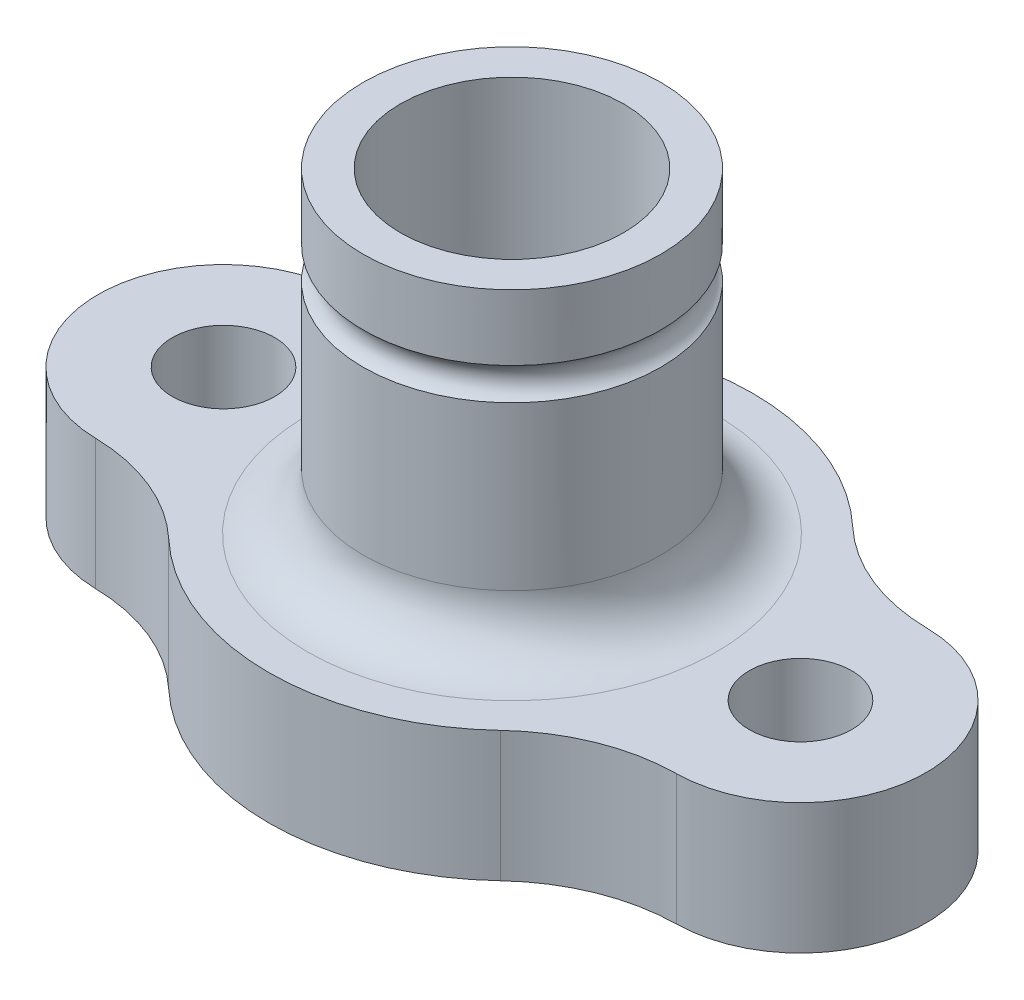
ISO-10303-21;
HEADER;
FILE_DESCRIPTION(('STEP AP214'),'2;1');
FILE_NAME('part.step','',(''),(''),'','','');
FILE_SCHEMA(('AUTOMOTIVE_DESIGN { 1 0 10303 214 1 1 1 1 }'));
ENDSEC;
DATA;
#1=APPLICATION_CONTEXT('core data for automotive mechanical design processes');
#2=APPLICATION_PROTOCOL_DEFINITION('international standard','automotive_design',2000,#1);
#3=PRODUCT_CONTEXT('',#1,'mechanical');
#4=PRODUCT('Part','Part','',(#3));
#5=PRODUCT_RELATED_PRODUCT_CATEGORY('part','',(#4));
#6=PRODUCT_DEFINITION_FORMATION('','',#4);
#7=PRODUCT_DEFINITION_CONTEXT('part definition',#1,'design');
#8=PRODUCT_DEFINITION('design','',#6,#7);
#9=PRODUCT_DEFINITION_SHAPE('','',#8);
#10=(LENGTH_UNIT() NAMED_UNIT(*) SI_UNIT(.MILLI.,.METRE.));
#11=(NAMED_UNIT(*) PLANE_ANGLE_UNIT() SI_UNIT($,.RADIAN.));
#12=(NAMED_UNIT(*) SI_UNIT($,.STERADIAN.) SOLID_ANGLE_UNIT());
#13=UNCERTAINTY_MEASURE_WITH_UNIT(LENGTH_MEASURE(1.E-05),#10,'distance_accuracy_value','');
#14=(GEOMETRIC_REPRESENTATION_CONTEXT(3) GLOBAL_UNCERTAINTY_ASSIGNED_CONTEXT((#13)) GLOBAL_UNIT_ASSIGNED_CONTEXT((#10,
#11,#12)) REPRESENTATION_CONTEXT('',''));
#15=CARTESIAN_POINT('',(0.,0.,0.));
#16=DIRECTION('',(0.,0.,1.));
#17=DIRECTION('',(1.,0.,0.));
#18=AXIS2_PLACEMENT_3D('',#15,#16,#17);
#19=CARTESIAN_POINT('',(0.,19.6088446071888,0.));
#20=DIRECTION('',(0.,-1.,0.));
#21=DIRECTION('',(0.,0.,-1.));
#22=AXIS2_PLACEMENT_3D('',#19,#20,#21);
#23=TOROIDAL_SURFACE('',#22,8.5,1.);
#24=CARTESIAN_POINT('',(0.,18.7428192034043,0.));
#25=DIRECTION('',(0.,1.,0.));
#26=DIRECTION('',(0.,0.,1.));
#27=AXIS2_PLACEMENT_3D('',#24,#25,#26);
#28=CIRCLE('',#27,8.);
#29=CARTESIAN_POINT('',(0.,18.7428192034043,8.));
#30=VERTEX_POINT('',#29);
#31=EDGE_CURVE('E11',#30,#30,#28,.F.);
#32=ORIENTED_EDGE('',*,*,#31,.F.);
#33=EDGE_LOOP('',(#32));
#34=FACE_BOUND('',#33,.T.);
#35=CARTESIAN_POINT('',(0.,20.4748700109732,0.));
#36=DIRECTION('',(0.,-1.,0.));
#37=DIRECTION('',(0.,0.,-1.));
#38=AXIS2_PLACEMENT_3D('',#35,#36,#37);
#39=CIRCLE('',#38,8.);
#40=CARTESIAN_POINT('',(0.,20.4748700109732,-8.));
#41=VERTEX_POINT('',#40);
#42=EDGE_CURVE('E48',#41,#41,#39,.F.);
#43=ORIENTED_EDGE('',*,*,#42,.F.);
#44=EDGE_LOOP('',(#43));
#45=FACE_BOUND('',#44,.T.);
#46=ADVANCED_FACE('F39',(#34,#45),#23,.F.);
#47=CARTESIAN_POINT('',(0.,7.,0.));
#48=DIRECTION('',(0.,-1.,0.));
#49=DIRECTION('',(0.,0.,-1.));
#50=AXIS2_PLACEMENT_3D('',#47,#48,#49);
#51=CYLINDRICAL_SURFACE('',#50,7.);
#52=CARTESIAN_POINT('',(0.,4.76393202250021,0.));
#53=DIRECTION('',(0.,1.,0.));
#54=DIRECTION('',(0.,0.,1.));
#55=AXIS2_PLACEMENT_3D('',#52,#53,#54);
#56=CIRCLE('',#55,7.);
#57=CARTESIAN_POINT('',(0.,4.76393202250021,7.));
#58=VERTEX_POINT('',#57);
#59=EDGE_CURVE('E187',#58,#58,#56,.T.);
#60=ORIENTED_EDGE('',*,*,#59,.T.);
#61=EDGE_LOOP('',(#60));
#62=FACE_BOUND('',#61,.T.);
#63=CARTESIAN_POINT('',(0.,0.,0.));
#64=DIRECTION('',(0.,1.,0.));
#65=DIRECTION('',(0.,0.,1.));
#66=AXIS2_PLACEMENT_3D('',#63,#64,#65);
#67=CIRCLE('',#66,7.);
#68=CARTESIAN_POINT('',(0.,0.,7.));
#69=VERTEX_POINT('',#68);
#70=EDGE_CURVE('E147',#69,#69,#67,.T.);
#71=ORIENTED_EDGE('',*,*,#70,.F.);
#72=EDGE_LOOP('',(#71));
#73=FACE_BOUND('',#72,.T.);
#74=ADVANCED_FACE('F214',(#62,#73),#51,.F.);
#75=CARTESIAN_POINT('',(0.,4.76393202250021,0.));
#76=DIRECTION('',(0.,1.,0.));
#77=DIRECTION('',(0.,0.,1.));
#78=AXIS2_PLACEMENT_3D('',#75,#76,#77);
#79=TOROIDAL_SURFACE('',#78,4.,3.);
#80=CARTESIAN_POINT('',(0.,6.42224441767791,0.));
#81=DIRECTION('',(0.,-1.,0.));
#82=DIRECTION('',(0.,0.,-1.));
#83=AXIS2_PLACEMENT_3D('',#80,#81,#82);
#84=CIRCLE('',#83,6.5);
#85=CARTESIAN_POINT('',(0.,6.42224441767791,-6.5));
#86=VERTEX_POINT('',#85);
#87=EDGE_CURVE('E199',#86,#86,#84,.F.);
#88=ORIENTED_EDGE('',*,*,#87,.T.);
#89=EDGE_LOOP('',(#88));
#90=FACE_BOUND('',#89,.T.);
#91=ORIENTED_EDGE('',*,*,#59,.F.);
#92=EDGE_LOOP('',(#91));
#93=FACE_BOUND('',#92,.T.);
#94=ADVANCED_FACE('F220',(#90,#93),#79,.F.);
#95=CARTESIAN_POINT('',(0.,8.08055681285561,0.));
#96=DIRECTION('',(0.,-1.,0.));
#97=DIRECTION('',(0.,0.,-1.));
#98=AXIS2_PLACEMENT_3D('',#95,#96,#97);
#99=TOROIDAL_SURFACE('',#98,9.,3.);
#100=CARTESIAN_POINT('',(0.,8.08055681285561,0.));
#101=DIRECTION('',(0.,-1.,0.));
#102=DIRECTION('',(0.,0.,-1.));
#103=AXIS2_PLACEMENT_3D('',#100,#101,#102);
#104=CIRCLE('',#103,6.);
#105=CARTESIAN_POINT('',(0.,8.08055681285561,-6.));
#106=VERTEX_POINT('',#105);
#107=EDGE_CURVE('E203',#106,#106,#104,.T.);
#108=ORIENTED_EDGE('',*,*,#107,.F.);
#109=EDGE_LOOP('',(#108));
#110=FACE_BOUND('',#109,.T.);
#111=ORIENTED_EDGE('',*,*,#87,.F.);
#112=EDGE_LOOP('',(#111));
#113=FACE_BOUND('',#112,.T.);
#114=ADVANCED_FACE('F251',(#110,#113),#99,.T.);
#115=CARTESIAN_POINT('',(0.,24.,0.));
#116=DIRECTION('',(0.,-1.,0.));
#117=DIRECTION('',(0.,0.,-1.));
#118=AXIS2_PLACEMENT_3D('',#115,#116,#117);
#119=CYLINDRICAL_SURFACE('',#118,6.);
#120=ORIENTED_EDGE('',*,*,#107,.T.);
#121=EDGE_LOOP('',(#120));
#122=FACE_BOUND('',#121,.T.);
#123=CARTESIAN_POINT('',(0.,24.,0.));
#124=DIRECTION('',(0.,1.,0.));
#125=DIRECTION('',(0.,0.,1.));
#126=AXIS2_PLACEMENT_3D('',#123,#124,#125);
#127=CIRCLE('',#126,6.);
#128=CARTESIAN_POINT('',(0.,24.,6.));
#129=VERTEX_POINT('',#128);
#130=EDGE_CURVE('E260',#129,#129,#127,.T.);
#131=ORIENTED_EDGE('',*,*,#130,.T.);
#132=EDGE_LOOP('',(#131));
#133=FACE_BOUND('',#132,.T.);
#134=ADVANCED_FACE('F246',(#122,#133),#119,.F.);
#135=CARTESIAN_POINT('',(0.,24.,0.));
#136=DIRECTION('',(0.,1.,0.));
#137=DIRECTION('',(0.,0.,1.));
#138=AXIS2_PLACEMENT_3D('',#135,#136,#137);
#139=PLANE('',#138);
#140=CARTESIAN_POINT('',(0.,24.,0.));
#141=DIRECTION('',(0.,1.,0.));
#142=DIRECTION('',(0.,0.,1.));
#143=AXIS2_PLACEMENT_3D('',#140,#141,#142);
#144=CIRCLE('',#143,8.);
#145=CARTESIAN_POINT('',(0.,24.,8.));
#146=VERTEX_POINT('',#145);
#147=EDGE_CURVE('E257',#146,#146,#144,.T.);
#148=ORIENTED_EDGE('',*,*,#147,.T.);
#149=EDGE_LOOP('',(#148));
#150=FACE_BOUND('',#149,.T.);
#151=ORIENTED_EDGE('',*,*,#130,.F.);
#152=EDGE_LOOP('',(#151));
#153=FACE_BOUND('',#152,.T.);
#154=ADVANCED_FACE('F238',(#150,#153),#139,.T.);
#155=CARTESIAN_POINT('',(0.,24.,0.));
#156=DIRECTION('',(0.,-1.,0.));
#157=DIRECTION('',(0.,0.,-1.));
#158=AXIS2_PLACEMENT_3D('',#155,#156,#157);
#159=CYLINDRICAL_SURFACE('',#158,8.);
#160=ORIENTED_EDGE('',*,*,#42,.T.);
#161=EDGE_LOOP('',(#160));
#162=FACE_BOUND('',#161,.T.);
#163=ORIENTED_EDGE('',*,*,#147,.F.);
#164=EDGE_LOOP('',(#163));
#165=FACE_BOUND('',#164,.T.);
#166=ADVANCED_FACE('F210',(#162,#165),#159,.T.);
#167=CARTESIAN_POINT('',(-15.6666732992892,0.,8.37334132896206));
#168=DIRECTION('',(0.,1.,0.));
#169=DIRECTION('',(0.,0.,1.));
#170=AXIS2_PLACEMENT_3D('',#167,#168,#169);
#171=PLANE('',#170);
#172=CARTESIAN_POINT('',(-15.8333465985785,0.,16.7466826579241));
#173=DIRECTION('',(0.,-1.,0.));
#174=DIRECTION('',(0.,0.,1.));
#175=AXIS2_PLACEMENT_3D('',#172,#173,#174);
#176=CIRCLE('',#175,10.);
#177=CARTESIAN_POINT('',(-15.6343337039048,0.,6.74866316065599));
#178=VERTEX_POINT('',#177);
#179=CARTESIAN_POINT('',(-8.97881406538982,0.,9.46551628491364));
#180=VERTEX_POINT('',#179);
#181=EDGE_CURVE('E142',#178,#180,#176,.T.);
#182=ORIENTED_EDGE('',*,*,#181,.F.);
#183=CARTESIAN_POINT('',(-15.5,0.,0.));
#184=DIRECTION('',(0.,1.,0.));
#185=DIRECTION('',(0.,0.,1.));
#186=AXIS2_PLACEMENT_3D('',#183,#184,#185);
#187=CIRCLE('',#186,6.75);
#188=CARTESIAN_POINT('',(-15.6343337039047,0.,-6.74866316065598));
#189=VERTEX_POINT('',#188);
#190=EDGE_CURVE('E91',#189,#178,#187,.T.);
#191=ORIENTED_EDGE('',*,*,#190,.F.);
#192=CARTESIAN_POINT('',(-15.8333465985785,0.,-16.7466826579241));
#193=DIRECTION('',(0.,-1.,0.));
#194=DIRECTION('',(0.,0.,-1.));
#195=AXIS2_PLACEMENT_3D('',#192,#193,#194);
#196=CIRCLE('',#195,10.);
#197=CARTESIAN_POINT('',(-8.97881406538982,0.,-9.46551628491363));
#198=VERTEX_POINT('',#197);
#199=EDGE_CURVE('E85',#198,#189,#196,.T.);
#200=ORIENTED_EDGE('',*,*,#199,.F.);
#201=CARTESIAN_POINT('',(-0.0679217722446071,0.,0.));
#202=DIRECTION('',(0.,1.,0.));
#203=DIRECTION('',(0.,0.,1.));
#204=AXIS2_PLACEMENT_3D('',#201,#202,#203);
#205=CIRCLE('',#204,13.);
#206=CARTESIAN_POINT('',(8.84166144320779,0.,-9.46674848757106));
#207=VERTEX_POINT('',#206);
#208=EDGE_CURVE('E129',#207,#198,#205,.T.);
#209=ORIENTED_EDGE('',*,*,#208,.F.);
#210=CARTESIAN_POINT('',(15.6951869935558,0.,-16.7488627087796));
#211=DIRECTION('',(0.,-1.,0.));
#212=DIRECTION('',(0.,0.,-1.));
#213=AXIS2_PLACEMENT_3D('',#210,#211,#212);
#214=CIRCLE('',#213,10.);
#215=CARTESIAN_POINT('',(15.5786574451643,0.,-6.74954168861266));
#216=VERTEX_POINT('',#215);
#217=EDGE_CURVE('E156',#216,#207,#214,.T.);
#218=ORIENTED_EDGE('',*,*,#217,.F.);
#219=CARTESIAN_POINT('',(15.5,0.,0.));
#220=DIRECTION('',(0.,1.,0.));
#221=DIRECTION('',(0.,0.,1.));
#222=AXIS2_PLACEMENT_3D('',#219,#220,#221);
#223=CIRCLE('',#222,6.75);
#224=CARTESIAN_POINT('',(15.5786574451643,0.,6.74954168861266));
#225=VERTEX_POINT('',#224);
#226=EDGE_CURVE('E153',#225,#216,#223,.T.);
#227=ORIENTED_EDGE('',*,*,#226,.F.);
#228=CARTESIAN_POINT('',(15.6951869935558,0.,16.7488627087796));
#229=DIRECTION('',(0.,-1.,0.));
#230=DIRECTION('',(0.,0.,-1.));
#231=AXIS2_PLACEMENT_3D('',#228,#229,#230);
#232=CIRCLE('',#231,10.);
#233=CARTESIAN_POINT('',(8.8416614432078,0.,9.46674848757105));
#234=VERTEX_POINT('',#233);
#235=EDGE_CURVE('E150',#234,#225,#232,.T.);
#236=ORIENTED_EDGE('',*,*,#235,.F.);
#237=CARTESIAN_POINT('',(-0.0679217722446071,0.,0.));
#238=DIRECTION('',(0.,1.,0.));
#239=DIRECTION('',(0.,0.,1.));
#240=AXIS2_PLACEMENT_3D('',#237,#238,#239);
#241=CIRCLE('',#240,13.);
#242=EDGE_CURVE('E146',#180,#234,#241,.T.);
#243=ORIENTED_EDGE('',*,*,#242,.F.);
#244=EDGE_LOOP('',(#182,#191,#200,#209,#218,#227,#236,#243));
#245=FACE_BOUND('',#244,.T.);
#246=ORIENTED_EDGE('',*,*,#70,.T.);
#247=EDGE_LOOP('',(#246));
#248=FACE_BOUND('',#247,.T.);
#249=CARTESIAN_POINT('',(-15.5,0.,0.));
#250=DIRECTION('',(0.,1.,0.));
#251=DIRECTION('',(0.,0.,1.));
#252=AXIS2_PLACEMENT_3D('',#249,#250,#251);
#253=CIRCLE('',#252,2.75);
#254=CARTESIAN_POINT('',(-15.5,0.,2.75));
#255=VERTEX_POINT('',#254);
#256=EDGE_CURVE('E272',#255,#255,#253,.T.);
#257=ORIENTED_EDGE('',*,*,#256,.T.);
#258=EDGE_LOOP('',(#257));
#259=FACE_BOUND('',#258,.T.);
#260=CARTESIAN_POINT('',(15.5,0.,0.));
#261=DIRECTION('',(0.,1.,0.));
#262=DIRECTION('',(0.,0.,1.));
#263=AXIS2_PLACEMENT_3D('',#260,#261,#262);
#264=CIRCLE('',#263,2.75);
#265=CARTESIAN_POINT('',(15.5,0.,2.75));
#266=VERTEX_POINT('',#265);
#267=EDGE_CURVE('E265',#266,#266,#264,.T.);
#268=ORIENTED_EDGE('',*,*,#267,.T.);
#269=EDGE_LOOP('',(#268));
#270=FACE_BOUND('',#269,.T.);
#271=ADVANCED_FACE('F237',(#245,#248,#259,#270),#171,.F.);
#272=CARTESIAN_POINT('',(15.5,7.,0.));
#273=DIRECTION('',(0.,-1.,0.));
#274=DIRECTION('',(0.,0.,-1.));
#275=AXIS2_PLACEMENT_3D('',#272,#273,#274);
#276=CYLINDRICAL_SURFACE('',#275,2.75);
#277=CARTESIAN_POINT('',(15.5,7.,0.));
#278=DIRECTION('',(0.,1.,0.));
#279=DIRECTION('',(0.,0.,1.));
#280=AXIS2_PLACEMENT_3D('',#277,#278,#279);
#281=CIRCLE('',#280,2.75);
#282=CARTESIAN_POINT('',(15.5,7.,2.75));
#283=VERTEX_POINT('',#282);
#284=EDGE_CURVE('E268',#283,#283,#281,.T.);
#285=ORIENTED_EDGE('',*,*,#284,.T.);
#286=EDGE_LOOP('',(#285));
#287=FACE_BOUND('',#286,.T.);
#288=ORIENTED_EDGE('',*,*,#267,.F.);
#289=EDGE_LOOP('',(#288));
#290=FACE_BOUND('',#289,.T.);
#291=ADVANCED_FACE('F243',(#287,#290),#276,.F.);
#292=CARTESIAN_POINT('',(-15.5,7.,0.));
#293=DIRECTION('',(0.,-1.,0.));
#294=DIRECTION('',(0.,0.,-1.));
#295=AXIS2_PLACEMENT_3D('',#292,#293,#294);
#296=CYLINDRICAL_SURFACE('',#295,6.75);
#297=ORIENTED_EDGE('',*,*,#190,.T.);
#298=DIRECTION('',(0.,-1.,0.));
#299=VECTOR('',#298,1.);
#300=CARTESIAN_POINT('',(-15.6343337039048,7.,6.74866316065599));
#301=LINE('',#300,#299);
#302=CARTESIAN_POINT('',(-15.6343337039048,7.,6.74866316065599));
#303=VERTEX_POINT('',#302);
#304=EDGE_CURVE('E138',#303,#178,#301,.T.);
#305=ORIENTED_EDGE('',*,*,#304,.F.);
#306=CARTESIAN_POINT('',(-15.5,7.,0.));
#307=DIRECTION('',(0.,1.,0.));
#308=DIRECTION('',(0.,0.,1.));
#309=AXIS2_PLACEMENT_3D('',#306,#307,#308);
#310=CIRCLE('',#309,6.75);
#311=CARTESIAN_POINT('',(-15.6343337039047,7.,-6.74866316065598));
#312=VERTEX_POINT('',#311);
#313=EDGE_CURVE('E56',#312,#303,#310,.T.);
#314=ORIENTED_EDGE('',*,*,#313,.F.);
#315=DIRECTION('',(0.,-1.,0.));
#316=VECTOR('',#315,1.);
#317=CARTESIAN_POINT('',(-15.6343337039047,7.,-6.74866316065598));
#318=LINE('',#317,#316);
#319=EDGE_CURVE('E132',#312,#189,#318,.T.);
#320=ORIENTED_EDGE('',*,*,#319,.T.);
#321=EDGE_LOOP('',(#297,#305,#314,#320));
#322=FACE_BOUND('',#321,.T.);
#323=ADVANCED_FACE('F313',(#322),#296,.T.);
#324=CARTESIAN_POINT('',(-15.8333465985785,7.,-16.7466826579241));
#325=DIRECTION('',(0.,-1.,0.));
#326=DIRECTION('',(0.,0.,-1.));
#327=AXIS2_PLACEMENT_3D('',#324,#325,#326);
#328=CYLINDRICAL_SURFACE('',#327,10.);
#329=ORIENTED_EDGE('',*,*,#199,.T.);
#330=ORIENTED_EDGE('',*,*,#319,.F.);
#331=CARTESIAN_POINT('',(-15.8333465985785,7.,-16.7466826579241));
#332=DIRECTION('',(0.,-1.,0.));
#333=DIRECTION('',(0.,0.,-1.));
#334=AXIS2_PLACEMENT_3D('',#331,#332,#333);
#335=CIRCLE('',#334,10.);
#336=CARTESIAN_POINT('',(-8.97881406538982,7.,-9.46551628491363));
#337=VERTEX_POINT('',#336);
#338=EDGE_CURVE('E118',#337,#312,#335,.T.);
#339=ORIENTED_EDGE('',*,*,#338,.F.);
#340=DIRECTION('',(0.,-1.,0.));
#341=VECTOR('',#340,1.);
#342=CARTESIAN_POINT('',(-8.97881406538982,7.,-9.46551628491363));
#343=LINE('',#342,#341);
#344=EDGE_CURVE('E126',#337,#198,#343,.T.);
#345=ORIENTED_EDGE('',*,*,#344,.T.);
#346=EDGE_LOOP('',(#329,#330,#339,#345));
#347=FACE_BOUND('',#346,.T.);
#348=ADVANCED_FACE('F134',(#347),#328,.F.);
#349=CARTESIAN_POINT('',(-0.0679217722446071,7.,0.));
#350=DIRECTION('',(0.,-1.,0.));
#351=DIRECTION('',(0.,0.,-1.));
#352=AXIS2_PLACEMENT_3D('',#349,#350,#351);
#353=CYLINDRICAL_SURFACE('',#352,13.);
#354=ORIENTED_EDGE('',*,*,#208,.T.);
#355=ORIENTED_EDGE('',*,*,#344,.F.);
#356=CARTESIAN_POINT('',(-0.0679217722446071,7.,0.));
#357=DIRECTION('',(0.,1.,0.));
#358=DIRECTION('',(0.,0.,1.));
#359=AXIS2_PLACEMENT_3D('',#356,#357,#358);
#360=CIRCLE('',#359,13.);
#361=CARTESIAN_POINT('',(8.84166144320779,7.,-9.46674848757106));
#362=VERTEX_POINT('',#361);
#363=EDGE_CURVE('E113',#362,#337,#360,.T.);
#364=ORIENTED_EDGE('',*,*,#363,.F.);
#365=DIRECTION('',(0.,-1.,0.));
#366=VECTOR('',#365,1.);
#367=CARTESIAN_POINT('',(8.84166144320779,7.,-9.46674848757106));
#368=LINE('',#367,#366);
#369=EDGE_CURVE('E131',#362,#207,#368,.T.);
#370=ORIENTED_EDGE('',*,*,#369,.T.);
#371=EDGE_LOOP('',(#354,#355,#364,#370));
#372=FACE_BOUND('',#371,.T.);
#373=ADVANCED_FACE('F127',(#372),#353,.T.);
#374=CARTESIAN_POINT('',(15.6951869935558,7.,-16.7488627087796));
#375=DIRECTION('',(0.,-1.,0.));
#376=DIRECTION('',(0.,0.,-1.));
#377=AXIS2_PLACEMENT_3D('',#374,#375,#376);
#378=CYLINDRICAL_SURFACE('',#377,10.);
#379=ORIENTED_EDGE('',*,*,#217,.T.);
#380=ORIENTED_EDGE('',*,*,#369,.F.);
#381=CARTESIAN_POINT('',(15.6951869935558,7.,-16.7488627087796));
#382=DIRECTION('',(0.,-1.,0.));
#383=DIRECTION('',(0.,0.,-1.));
#384=AXIS2_PLACEMENT_3D('',#381,#382,#383);
#385=CIRCLE('',#384,10.);
#386=CARTESIAN_POINT('',(15.5786574451643,7.,-6.74954168861266));
#387=VERTEX_POINT('',#386);
#388=EDGE_CURVE('E120',#387,#362,#385,.T.);
#389=ORIENTED_EDGE('',*,*,#388,.F.);
#390=DIRECTION('',(0.,-1.,0.));
#391=VECTOR('',#390,1.);
#392=CARTESIAN_POINT('',(15.5786574451643,7.,-6.74954168861266));
#393=LINE('',#392,#391);
#394=EDGE_CURVE('E172',#387,#216,#393,.T.);
#395=ORIENTED_EDGE('',*,*,#394,.T.);
#396=EDGE_LOOP('',(#379,#380,#389,#395));
#397=FACE_BOUND('',#396,.T.);
#398=ADVANCED_FACE('F305',(#397),#378,.F.);
#399=CARTESIAN_POINT('',(15.5,7.,0.));
#400=DIRECTION('',(0.,-1.,0.));
#401=DIRECTION('',(0.,0.,-1.));
#402=AXIS2_PLACEMENT_3D('',#399,#400,#401);
#403=CYLINDRICAL_SURFACE('',#402,6.75);
#404=ORIENTED_EDGE('',*,*,#226,.T.);
#405=ORIENTED_EDGE('',*,*,#394,.F.);
#406=CARTESIAN_POINT('',(15.5,7.,0.));
#407=DIRECTION('',(0.,1.,0.));
#408=DIRECTION('',(0.,0.,1.));
#409=AXIS2_PLACEMENT_3D('',#406,#407,#408);
#410=CIRCLE('',#409,6.75);
#411=CARTESIAN_POINT('',(15.5786574451643,7.,6.74954168861266));
#412=VERTEX_POINT('',#411);
#413=EDGE_CURVE('E293',#412,#387,#410,.T.);
#414=ORIENTED_EDGE('',*,*,#413,.F.);
#415=DIRECTION('',(0.,-1.,0.));
#416=VECTOR('',#415,1.);
#417=CARTESIAN_POINT('',(15.5786574451643,7.,6.74954168861266));
#418=LINE('',#417,#416);
#419=EDGE_CURVE('E176',#412,#225,#418,.T.);
#420=ORIENTED_EDGE('',*,*,#419,.T.);
#421=EDGE_LOOP('',(#404,#405,#414,#420));
#422=FACE_BOUND('',#421,.T.);
#423=ADVANCED_FACE('F301',(#422),#403,.T.);
#424=CARTESIAN_POINT('',(15.6951869935558,7.,16.7488627087796));
#425=DIRECTION('',(0.,-1.,0.));
#426=DIRECTION('',(0.,0.,-1.));
#427=AXIS2_PLACEMENT_3D('',#424,#425,#426);
#428=CYLINDRICAL_SURFACE('',#427,10.);
#429=ORIENTED_EDGE('',*,*,#235,.T.);
#430=ORIENTED_EDGE('',*,*,#419,.F.);
#431=CARTESIAN_POINT('',(15.6951869935558,7.,16.7488627087796));
#432=DIRECTION('',(0.,-1.,0.));
#433=DIRECTION('',(0.,0.,-1.));
#434=AXIS2_PLACEMENT_3D('',#431,#432,#433);
#435=CIRCLE('',#434,10.);
#436=CARTESIAN_POINT('',(8.8416614432078,7.,9.46674848757105));
#437=VERTEX_POINT('',#436);
#438=EDGE_CURVE('E290',#437,#412,#435,.T.);
#439=ORIENTED_EDGE('',*,*,#438,.F.);
#440=DIRECTION('',(0.,-1.,0.));
#441=VECTOR('',#440,1.);
#442=CARTESIAN_POINT('',(8.8416614432078,7.,9.46674848757105));
#443=LINE('',#442,#441);
#444=EDGE_CURVE('E180',#437,#234,#443,.T.);
#445=ORIENTED_EDGE('',*,*,#444,.T.);
#446=EDGE_LOOP('',(#429,#430,#439,#445));
#447=FACE_BOUND('',#446,.T.);
#448=ADVANCED_FACE('F330',(#447),#428,.F.);
#449=CARTESIAN_POINT('',(-0.0679217722446071,7.,0.));
#450=DIRECTION('',(0.,-1.,0.));
#451=DIRECTION('',(0.,0.,-1.));
#452=AXIS2_PLACEMENT_3D('',#449,#450,#451);
#453=CYLINDRICAL_SURFACE('',#452,13.);
#454=ORIENTED_EDGE('',*,*,#242,.T.);
#455=ORIENTED_EDGE('',*,*,#444,.F.);
#456=CARTESIAN_POINT('',(-0.0679217722446071,7.,0.));
#457=DIRECTION('',(0.,1.,0.));
#458=DIRECTION('',(0.,0.,1.));
#459=AXIS2_PLACEMENT_3D('',#456,#457,#458);
#460=CIRCLE('',#459,13.);
#461=CARTESIAN_POINT('',(-8.97881406538982,7.,9.46551628491364));
#462=VERTEX_POINT('',#461);
#463=EDGE_CURVE('E100',#462,#437,#460,.T.);
#464=ORIENTED_EDGE('',*,*,#463,.F.);
#465=DIRECTION('',(0.,-1.,0.));
#466=VECTOR('',#465,1.);
#467=CARTESIAN_POINT('',(-8.97881406538982,7.,9.46551628491364));
#468=LINE('',#467,#466);
#469=EDGE_CURVE('E184',#462,#180,#468,.T.);
#470=ORIENTED_EDGE('',*,*,#469,.T.);
#471=EDGE_LOOP('',(#454,#455,#464,#470));
#472=FACE_BOUND('',#471,.T.);
#473=ADVANCED_FACE('F333',(#472),#453,.T.);
#474=CARTESIAN_POINT('',(-15.8333465985785,7.,16.7466826579241));
#475=DIRECTION('',(0.,-1.,0.));
#476=DIRECTION('',(0.,0.,-1.));
#477=AXIS2_PLACEMENT_3D('',#474,#475,#476);
#478=CYLINDRICAL_SURFACE('',#477,10.);
#479=ORIENTED_EDGE('',*,*,#181,.T.);
#480=ORIENTED_EDGE('',*,*,#469,.F.);
#481=CARTESIAN_POINT('',(-15.8333465985785,7.,16.7466826579241));
#482=DIRECTION('',(0.,-1.,0.));
#483=DIRECTION('',(0.,0.,1.));
#484=AXIS2_PLACEMENT_3D('',#481,#482,#483);
#485=CIRCLE('',#484,10.);
#486=EDGE_CURVE('E165',#303,#462,#485,.T.);
#487=ORIENTED_EDGE('',*,*,#486,.F.);
#488=ORIENTED_EDGE('',*,*,#304,.T.);
#489=EDGE_LOOP('',(#479,#480,#487,#488));
#490=FACE_BOUND('',#489,.T.);
#491=ADVANCED_FACE('F311',(#490),#478,.F.);
#492=CARTESIAN_POINT('',(-15.5,7.,0.));
#493=DIRECTION('',(0.,-1.,0.));
#494=DIRECTION('',(0.,0.,-1.));
#495=AXIS2_PLACEMENT_3D('',#492,#493,#494);
#496=CYLINDRICAL_SURFACE('',#495,2.75);
#497=CARTESIAN_POINT('',(-15.5,7.,0.));
#498=DIRECTION('',(0.,1.,0.));
#499=DIRECTION('',(0.,0.,1.));
#500=AXIS2_PLACEMENT_3D('',#497,#498,#499);
#501=CIRCLE('',#500,2.75);
#502=CARTESIAN_POINT('',(-15.5,7.,2.75));
#503=VERTEX_POINT('',#502);
#504=EDGE_CURVE('E276',#503,#503,#501,.T.);
#505=ORIENTED_EDGE('',*,*,#504,.T.);
#506=EDGE_LOOP('',(#505));
#507=FACE_BOUND('',#506,.T.);
#508=ORIENTED_EDGE('',*,*,#256,.F.);
#509=EDGE_LOOP('',(#508));
#510=FACE_BOUND('',#509,.T.);
#511=ADVANCED_FACE('F339',(#507,#510),#496,.F.);
#512=CARTESIAN_POINT('',(-15.6666732992892,7.,8.37334132896206));
#513=DIRECTION('',(0.,1.,0.));
#514=DIRECTION('',(0.,0.,1.));
#515=AXIS2_PLACEMENT_3D('',#512,#513,#514);
#516=PLANE('',#515);
#517=CARTESIAN_POINT('',(0.,7.,0.));
#518=DIRECTION('',(0.,1.,0.));
#519=DIRECTION('',(0.,0.,1.));
#520=AXIS2_PLACEMENT_3D('',#517,#518,#519);
#521=CIRCLE('',#520,11.);
#522=CARTESIAN_POINT('',(0.,7.,11.));
#523=VERTEX_POINT('',#522);
#524=EDGE_CURVE('E195',#523,#523,#521,.F.);
#525=ORIENTED_EDGE('',*,*,#524,.T.);
#526=EDGE_LOOP('',(#525));
#527=FACE_BOUND('',#526,.T.);
#528=ORIENTED_EDGE('',*,*,#504,.F.);
#529=EDGE_LOOP('',(#528));
#530=FACE_BOUND('',#529,.T.);
#531=ORIENTED_EDGE('',*,*,#486,.T.);
#532=ORIENTED_EDGE('',*,*,#463,.T.);
#533=ORIENTED_EDGE('',*,*,#438,.T.);
#534=ORIENTED_EDGE('',*,*,#413,.T.);
#535=ORIENTED_EDGE('',*,*,#388,.T.);
#536=ORIENTED_EDGE('',*,*,#363,.T.);
#537=ORIENTED_EDGE('',*,*,#338,.T.);
#538=ORIENTED_EDGE('',*,*,#313,.T.);
#539=EDGE_LOOP('',(#531,#532,#533,#534,#535,#536,#537,#538));
#540=FACE_BOUND('',#539,.T.);
#541=ORIENTED_EDGE('',*,*,#284,.F.);
#542=EDGE_LOOP('',(#541));
#543=FACE_BOUND('',#542,.T.);
#544=ADVANCED_FACE('F115',(#527,#530,#540,#543),#516,.T.);
#545=CARTESIAN_POINT('',(0.,10.,0.));
#546=DIRECTION('',(0.,1.,0.));
#547=DIRECTION('',(0.,0.,1.));
#548=AXIS2_PLACEMENT_3D('',#545,#546,#547);
#549=TOROIDAL_SURFACE('',#548,11.,3.);
#550=ORIENTED_EDGE('',*,*,#524,.F.);
#551=EDGE_LOOP('',(#550));
#552=FACE_BOUND('',#551,.T.);
#553=CARTESIAN_POINT('',(0.,10.,0.));
#554=DIRECTION('',(0.,1.,0.));
#555=DIRECTION('',(0.,0.,1.));
#556=AXIS2_PLACEMENT_3D('',#553,#554,#555);
#557=CIRCLE('',#556,8.);
#558=CARTESIAN_POINT('',(0.,10.,8.));
#559=VERTEX_POINT('',#558);
#560=EDGE_CURVE('E191',#559,#559,#557,.T.);
#561=ORIENTED_EDGE('',*,*,#560,.F.);
#562=EDGE_LOOP('',(#561));
#563=FACE_BOUND('',#562,.T.);
#564=ADVANCED_FACE('F225',(#552,#563),#549,.F.);
#565=ORIENTED_EDGE('',*,*,#31,.T.);
#566=EDGE_LOOP('',(#565));
#567=FACE_BOUND('',#566,.T.);
#568=ORIENTED_EDGE('',*,*,#560,.T.);
#569=EDGE_LOOP('',(#568));
#570=FACE_BOUND('',#569,.T.);
#571=ADVANCED_FACE('F216',(#567,#570),#159,.T.);
#572=CLOSED_SHELL('',(#46,#74,#94,#114,#134,#154,#166,#271,#291,#323,#348,#373,#398,#423,#448,
#473,#491,#511,#544,#564,#571));
#573=MANIFOLD_SOLID_BREP('B2',#572);
#574=ADVANCED_BREP_SHAPE_REPRESENTATION('',(#18,#573),#14);
#575=SHAPE_DEFINITION_REPRESENTATION(#9,#574);
ENDSEC;
END-ISO-10303-21;
